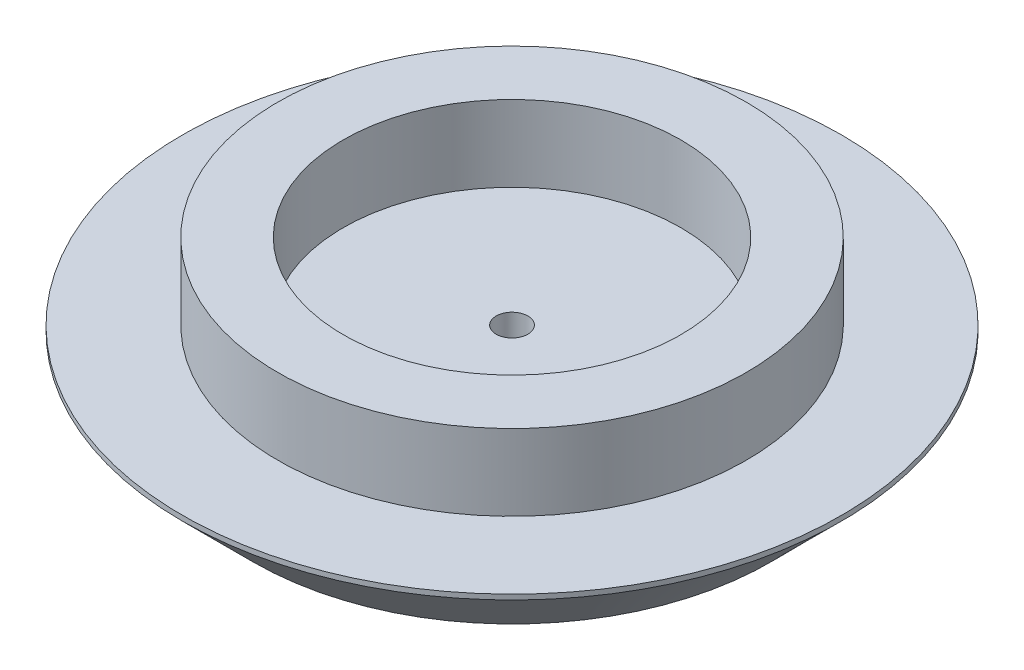
ISO-10303-21;
HEADER;
FILE_DESCRIPTION(('STEP AP214'),'2;1');
FILE_NAME('part.step','',(''),(''),'','','');
FILE_SCHEMA(('AUTOMOTIVE_DESIGN { 1 0 10303 214 1 1 1 1 }'));
ENDSEC;
DATA;
#1=APPLICATION_CONTEXT('core data for automotive mechanical design processes');
#2=APPLICATION_PROTOCOL_DEFINITION('international standard','automotive_design',2000,#1);
#3=PRODUCT_CONTEXT('',#1,'mechanical');
#4=PRODUCT('Part','Part','',(#3));
#5=PRODUCT_RELATED_PRODUCT_CATEGORY('part','',(#4));
#6=PRODUCT_DEFINITION_FORMATION('','',#4);
#7=PRODUCT_DEFINITION_CONTEXT('part definition',#1,'design');
#8=PRODUCT_DEFINITION('design','',#6,#7);
#9=PRODUCT_DEFINITION_SHAPE('','',#8);
#10=(LENGTH_UNIT() NAMED_UNIT(*) SI_UNIT(.MILLI.,.METRE.));
#11=(NAMED_UNIT(*) PLANE_ANGLE_UNIT() SI_UNIT($,.RADIAN.));
#12=(NAMED_UNIT(*) SI_UNIT($,.STERADIAN.) SOLID_ANGLE_UNIT());
#13=UNCERTAINTY_MEASURE_WITH_UNIT(LENGTH_MEASURE(1.E-05),#10,'distance_accuracy_value','');
#14=(GEOMETRIC_REPRESENTATION_CONTEXT(3) GLOBAL_UNCERTAINTY_ASSIGNED_CONTEXT((#13)) GLOBAL_UNIT_ASSIGNED_CONTEXT((#10,
#11,#12)) REPRESENTATION_CONTEXT('',''));
#15=CARTESIAN_POINT('',(0.,0.,0.));
#16=DIRECTION('',(0.,0.,1.));
#17=DIRECTION('',(1.,0.,0.));
#18=AXIS2_PLACEMENT_3D('',#15,#16,#17);
#19=CARTESIAN_POINT('',(-41.275,-9.525,0.));
#20=DIRECTION('',(0.,1.,0.));
#21=DIRECTION('',(0.,0.,1.));
#22=AXIS2_PLACEMENT_3D('',#19,#20,#21);
#23=PLANE('',#22);
#24=CARTESIAN_POINT('',(0.,-9.525,0.));
#25=DIRECTION('',(0.,-1.,0.));
#26=DIRECTION('',(0.,0.,-1.));
#27=AXIS2_PLACEMENT_3D('',#24,#25,#26);
#28=CIRCLE('',#27,1.984375);
#29=CARTESIAN_POINT('',(0.,-9.525,-1.984375));
#30=VERTEX_POINT('',#29);
#31=EDGE_CURVE('E66',#30,#30,#28,.T.);
#32=ORIENTED_EDGE('',*,*,#31,.F.);
#33=EDGE_LOOP('',(#32));
#34=FACE_BOUND('',#33,.T.);
#35=CARTESIAN_POINT('',(0.,-9.525,0.));
#36=DIRECTION('',(0.,1.,0.));
#37=DIRECTION('',(0.,0.,1.));
#38=AXIS2_PLACEMENT_3D('',#35,#36,#37);
#39=CIRCLE('',#38,32.385);
#40=CARTESIAN_POINT('',(0.,-9.525,32.385));
#41=VERTEX_POINT('',#40);
#42=EDGE_CURVE('E41',#41,#41,#39,.F.);
#43=ORIENTED_EDGE('',*,*,#42,.T.);
#44=EDGE_LOOP('',(#43));
#45=FACE_BOUND('',#44,.T.);
#46=ADVANCED_FACE('F34',(#34,#45),#23,.F.);
#47=CARTESIAN_POINT('',(0.,-9.525,0.));
#48=DIRECTION('',(0.,-1.,0.));
#49=DIRECTION('',(0.,0.,-1.));
#50=AXIS2_PLACEMENT_3D('',#47,#48,#49);
#51=CYLINDRICAL_SURFACE('',#50,41.275);
#52=CARTESIAN_POINT('',(0.,-0.634999999999943,0.));
#53=DIRECTION('',(0.,1.,0.));
#54=DIRECTION('',(0.,0.,1.));
#55=AXIS2_PLACEMENT_3D('',#52,#53,#54);
#56=CIRCLE('',#55,41.275);
#57=CARTESIAN_POINT('',(0.,-0.634999999999943,41.275));
#58=VERTEX_POINT('',#57);
#59=EDGE_CURVE('E10',#58,#58,#56,.T.);
#60=ORIENTED_EDGE('',*,*,#59,.T.);
#61=EDGE_LOOP('',(#60));
#62=FACE_BOUND('',#61,.T.);
#63=CARTESIAN_POINT('',(0.,0.,0.));
#64=DIRECTION('',(0.,-1.,0.));
#65=DIRECTION('',(0.,0.,-1.));
#66=AXIS2_PLACEMENT_3D('',#63,#64,#65);
#67=CIRCLE('',#66,41.275);
#68=CARTESIAN_POINT('',(0.,0.,-41.275));
#69=VERTEX_POINT('',#68);
#70=EDGE_CURVE('E45',#69,#69,#67,.T.);
#71=ORIENTED_EDGE('',*,*,#70,.T.);
#72=EDGE_LOOP('',(#71));
#73=FACE_BOUND('',#72,.T.);
#74=ADVANCED_FACE('F73',(#62,#73),#51,.T.);
#75=CARTESIAN_POINT('',(-29.337,0.,0.));
#76=DIRECTION('',(0.,-1.,0.));
#77=DIRECTION('',(0.,0.,-1.));
#78=AXIS2_PLACEMENT_3D('',#75,#76,#77);
#79=PLANE('',#78);
#80=ORIENTED_EDGE('',*,*,#70,.F.);
#81=EDGE_LOOP('',(#80));
#82=FACE_BOUND('',#81,.T.);
#83=CARTESIAN_POINT('',(0.,0.,0.));
#84=DIRECTION('',(0.,-1.,0.));
#85=DIRECTION('',(0.,0.,-1.));
#86=AXIS2_PLACEMENT_3D('',#83,#84,#85);
#87=CIRCLE('',#86,29.337);
#88=CARTESIAN_POINT('',(0.,0.,-29.337));
#89=VERTEX_POINT('',#88);
#90=EDGE_CURVE('E49',#89,#89,#87,.T.);
#91=ORIENTED_EDGE('',*,*,#90,.T.);
#92=EDGE_LOOP('',(#91));
#93=FACE_BOUND('',#92,.T.);
#94=ADVANCED_FACE('F77',(#82,#93),#79,.F.);
#95=CARTESIAN_POINT('',(0.,-9.525,0.));
#96=DIRECTION('',(0.,-1.,0.));
#97=DIRECTION('',(0.,0.,-1.));
#98=AXIS2_PLACEMENT_3D('',#95,#96,#97);
#99=CYLINDRICAL_SURFACE('',#98,29.337);
#100=ORIENTED_EDGE('',*,*,#90,.F.);
#101=EDGE_LOOP('',(#100));
#102=FACE_BOUND('',#101,.T.);
#103=CARTESIAN_POINT('',(0.,9.525,0.));
#104=DIRECTION('',(0.,-1.,0.));
#105=DIRECTION('',(0.,0.,-1.));
#106=AXIS2_PLACEMENT_3D('',#103,#104,#105);
#107=CIRCLE('',#106,29.337);
#108=CARTESIAN_POINT('',(0.,9.525,-29.337));
#109=VERTEX_POINT('',#108);
#110=EDGE_CURVE('E54',#109,#109,#107,.T.);
#111=ORIENTED_EDGE('',*,*,#110,.T.);
#112=EDGE_LOOP('',(#111));
#113=FACE_BOUND('',#112,.T.);
#114=ADVANCED_FACE('F82',(#102,#113),#99,.T.);
#115=CARTESIAN_POINT('',(-29.337,9.525,0.));
#116=DIRECTION('',(0.,-1.,0.));
#117=DIRECTION('',(0.,0.,-1.));
#118=AXIS2_PLACEMENT_3D('',#115,#116,#117);
#119=PLANE('',#118);
#120=ORIENTED_EDGE('',*,*,#110,.F.);
#121=EDGE_LOOP('',(#120));
#122=FACE_BOUND('',#121,.T.);
#123=CARTESIAN_POINT('',(0.,9.525,0.));
#124=DIRECTION('',(0.,-1.,0.));
#125=DIRECTION('',(0.,0.,-1.));
#126=AXIS2_PLACEMENT_3D('',#123,#124,#125);
#127=CIRCLE('',#126,21.1455);
#128=CARTESIAN_POINT('',(0.,9.525,-21.1455));
#129=VERTEX_POINT('',#128);
#130=EDGE_CURVE('E57',#129,#129,#127,.T.);
#131=ORIENTED_EDGE('',*,*,#130,.T.);
#132=EDGE_LOOP('',(#131));
#133=FACE_BOUND('',#132,.T.);
#134=ADVANCED_FACE('F86',(#122,#133),#119,.F.);
#135=CARTESIAN_POINT('',(0.,-9.525,0.));
#136=DIRECTION('',(0.,-1.,0.));
#137=DIRECTION('',(0.,0.,-1.));
#138=AXIS2_PLACEMENT_3D('',#135,#136,#137);
#139=CYLINDRICAL_SURFACE('',#138,21.1455);
#140=ORIENTED_EDGE('',*,*,#130,.F.);
#141=EDGE_LOOP('',(#140));
#142=FACE_BOUND('',#141,.T.);
#143=CARTESIAN_POINT('',(0.,0.,0.));
#144=DIRECTION('',(0.,-1.,0.));
#145=DIRECTION('',(0.,0.,-1.));
#146=AXIS2_PLACEMENT_3D('',#143,#144,#145);
#147=CIRCLE('',#146,21.1455);
#148=CARTESIAN_POINT('',(0.,0.,-21.1455));
#149=VERTEX_POINT('',#148);
#150=EDGE_CURVE('E60',#149,#149,#147,.T.);
#151=ORIENTED_EDGE('',*,*,#150,.T.);
#152=EDGE_LOOP('',(#151));
#153=FACE_BOUND('',#152,.T.);
#154=ADVANCED_FACE('F90',(#142,#153),#139,.F.);
#155=CARTESIAN_POINT('',(-21.1455,0.,0.));
#156=DIRECTION('',(0.,-1.,0.));
#157=DIRECTION('',(0.,0.,-1.));
#158=AXIS2_PLACEMENT_3D('',#155,#156,#157);
#159=PLANE('',#158);
#160=CARTESIAN_POINT('',(0.,0.,0.));
#161=DIRECTION('',(0.,-1.,0.));
#162=DIRECTION('',(0.,0.,-1.));
#163=AXIS2_PLACEMENT_3D('',#160,#161,#162);
#164=CIRCLE('',#163,1.984375);
#165=CARTESIAN_POINT('',(0.,0.,-1.984375));
#166=VERTEX_POINT('',#165);
#167=EDGE_CURVE('E63',#166,#166,#164,.T.);
#168=ORIENTED_EDGE('',*,*,#167,.T.);
#169=EDGE_LOOP('',(#168));
#170=FACE_BOUND('',#169,.T.);
#171=ORIENTED_EDGE('',*,*,#150,.F.);
#172=EDGE_LOOP('',(#171));
#173=FACE_BOUND('',#172,.T.);
#174=ADVANCED_FACE('F94',(#170,#173),#159,.F.);
#175=CARTESIAN_POINT('',(0.,-9.525,0.));
#176=DIRECTION('',(0.,1.,0.));
#177=DIRECTION('',(0.,0.,1.));
#178=AXIS2_PLACEMENT_3D('',#175,#176,#177);
#179=CONICAL_SURFACE('',#178,32.385,0.785398163397447);
#180=ORIENTED_EDGE('',*,*,#59,.F.);
#181=EDGE_LOOP('',(#180));
#182=FACE_BOUND('',#181,.T.);
#183=ORIENTED_EDGE('',*,*,#42,.F.);
#184=EDGE_LOOP('',(#183));
#185=FACE_BOUND('',#184,.T.);
#186=ADVANCED_FACE('F36',(#182,#185),#179,.T.);
#187=CARTESIAN_POINT('',(0.,-9.525,0.));
#188=DIRECTION('',(0.,-1.,0.));
#189=DIRECTION('',(0.,0.,-1.));
#190=AXIS2_PLACEMENT_3D('',#187,#188,#189);
#191=CYLINDRICAL_SURFACE('',#190,1.984375);
#192=ORIENTED_EDGE('',*,*,#167,.F.);
#193=EDGE_LOOP('',(#192));
#194=FACE_BOUND('',#193,.T.);
#195=ORIENTED_EDGE('',*,*,#31,.T.);
#196=EDGE_LOOP('',(#195));
#197=FACE_BOUND('',#196,.T.);
#198=ADVANCED_FACE('F70',(#194,#197),#191,.F.);
#199=CLOSED_SHELL('',(#46,#74,#94,#114,#134,#154,#174,#186,#198));
#200=MANIFOLD_SOLID_BREP('B2',#199);
#201=ADVANCED_BREP_SHAPE_REPRESENTATION('',(#18,#200),#14);
#202=SHAPE_DEFINITION_REPRESENTATION(#9,#201);
ENDSEC;
END-ISO-10303-21;
